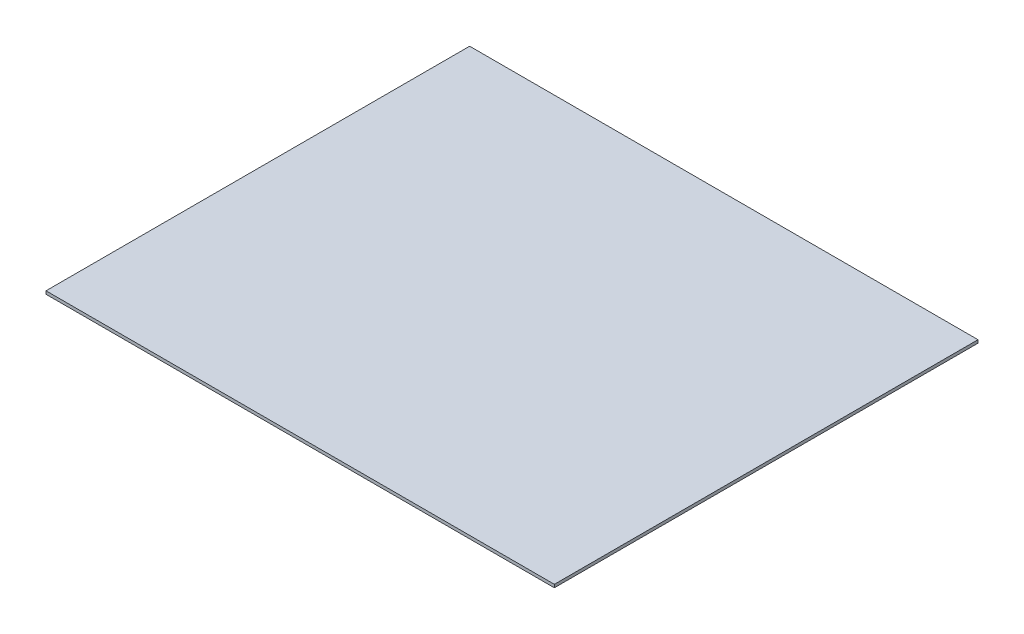
ISO-10303-21;
HEADER;
FILE_DESCRIPTION(('STEP AP214'),'2;1');
FILE_NAME('part.step','',(''),(''),'','','');
FILE_SCHEMA(('AUTOMOTIVE_DESIGN { 1 0 10303 214 1 1 1 1 }'));
ENDSEC;
DATA;
#1=APPLICATION_CONTEXT('core data for automotive mechanical design processes');
#2=APPLICATION_PROTOCOL_DEFINITION('international standard','automotive_design',2000,#1);
#3=PRODUCT_CONTEXT('',#1,'mechanical');
#4=PRODUCT('Part','Part','',(#3));
#5=PRODUCT_RELATED_PRODUCT_CATEGORY('part','',(#4));
#6=PRODUCT_DEFINITION_FORMATION('','',#4);
#7=PRODUCT_DEFINITION_CONTEXT('part definition',#1,'design');
#8=PRODUCT_DEFINITION('design','',#6,#7);
#9=PRODUCT_DEFINITION_SHAPE('','',#8);
#10=(LENGTH_UNIT() NAMED_UNIT(*) SI_UNIT(.MILLI.,.METRE.));
#11=(NAMED_UNIT(*) PLANE_ANGLE_UNIT() SI_UNIT($,.RADIAN.));
#12=(NAMED_UNIT(*) SI_UNIT($,.STERADIAN.) SOLID_ANGLE_UNIT());
#13=UNCERTAINTY_MEASURE_WITH_UNIT(LENGTH_MEASURE(1.E-05),#10,'distance_accuracy_value','');
#14=(GEOMETRIC_REPRESENTATION_CONTEXT(3) GLOBAL_UNCERTAINTY_ASSIGNED_CONTEXT((#13)) GLOBAL_UNIT_ASSIGNED_CONTEXT((#10,
#11,#12)) REPRESENTATION_CONTEXT('',''));
#15=CARTESIAN_POINT('',(0.,0.,0.));
#16=DIRECTION('',(0.,0.,1.));
#17=DIRECTION('',(1.,0.,0.));
#18=AXIS2_PLACEMENT_3D('',#15,#16,#17);
#19=CARTESIAN_POINT('',(0.,0.91186,0.));
#20=DIRECTION('',(1.,0.,0.));
#21=DIRECTION('',(0.,0.,-1.));
#22=AXIS2_PLACEMENT_3D('',#19,#20,#21);
#23=PLANE('',#22);
#24=DIRECTION('',(0.,0.,1.));
#25=VECTOR('',#24,1.);
#26=CARTESIAN_POINT('',(0.,0.,0.));
#27=LINE('',#26,#25);
#28=CARTESIAN_POINT('',(0.,0.,-127.));
#29=VERTEX_POINT('',#28);
#30=CARTESIAN_POINT('',(0.,0.,0.));
#31=VERTEX_POINT('',#30);
#32=EDGE_CURVE('E107',#29,#31,#27,.T.);
#33=ORIENTED_EDGE('',*,*,#32,.T.);
#34=DIRECTION('',(0.,-1.,0.));
#35=VECTOR('',#34,1.);
#36=CARTESIAN_POINT('',(0.,0.91186,0.));
#37=LINE('',#36,#35);
#38=CARTESIAN_POINT('',(0.,0.91186,0.));
#39=VERTEX_POINT('',#38);
#40=EDGE_CURVE('E11',#39,#31,#37,.T.);
#41=ORIENTED_EDGE('',*,*,#40,.F.);
#42=DIRECTION('',(0.,0.,1.));
#43=VECTOR('',#42,1.);
#44=CARTESIAN_POINT('',(0.,0.91186,0.));
#45=LINE('',#44,#43);
#46=CARTESIAN_POINT('',(0.,0.91186,-127.));
#47=VERTEX_POINT('',#46);
#48=EDGE_CURVE('E91',#47,#39,#45,.T.);
#49=ORIENTED_EDGE('',*,*,#48,.F.);
#50=DIRECTION('',(0.,-1.,0.));
#51=VECTOR('',#50,1.);
#52=CARTESIAN_POINT('',(0.,0.91186,-127.));
#53=LINE('',#52,#51);
#54=EDGE_CURVE('E103',#47,#29,#53,.T.);
#55=ORIENTED_EDGE('',*,*,#54,.T.);
#56=EDGE_LOOP('',(#33,#41,#49,#55));
#57=FACE_BOUND('',#56,.T.);
#58=ADVANCED_FACE('F39',(#57),#23,.F.);
#59=CARTESIAN_POINT('',(0.,0.91186,0.));
#60=DIRECTION('',(0.,0.,-1.));
#61=DIRECTION('',(-1.,0.,0.));
#62=AXIS2_PLACEMENT_3D('',#59,#60,#61);
#63=PLANE('',#62);
#64=DIRECTION('',(1.,0.,0.));
#65=VECTOR('',#64,1.);
#66=CARTESIAN_POINT('',(0.,0.,0.));
#67=LINE('',#66,#65);
#68=CARTESIAN_POINT('',(152.4,0.,0.));
#69=VERTEX_POINT('',#68);
#70=EDGE_CURVE('E96',#31,#69,#67,.T.);
#71=ORIENTED_EDGE('',*,*,#70,.T.);
#72=DIRECTION('',(0.,-1.,0.));
#73=VECTOR('',#72,1.);
#74=CARTESIAN_POINT('',(152.4,0.91186,0.));
#75=LINE('',#74,#73);
#76=CARTESIAN_POINT('',(152.4,0.91186,0.));
#77=VERTEX_POINT('',#76);
#78=EDGE_CURVE('E48',#77,#69,#75,.T.);
#79=ORIENTED_EDGE('',*,*,#78,.F.);
#80=DIRECTION('',(1.,0.,0.));
#81=VECTOR('',#80,1.);
#82=CARTESIAN_POINT('',(0.,0.91186,0.));
#83=LINE('',#82,#81);
#84=EDGE_CURVE('E86',#39,#77,#83,.T.);
#85=ORIENTED_EDGE('',*,*,#84,.F.);
#86=ORIENTED_EDGE('',*,*,#40,.T.);
#87=EDGE_LOOP('',(#71,#79,#85,#86));
#88=FACE_BOUND('',#87,.T.);
#89=ADVANCED_FACE('F95',(#88),#63,.F.);
#90=CARTESIAN_POINT('',(152.4,0.91186,0.));
#91=DIRECTION('',(-1.,0.,0.));
#92=DIRECTION('',(0.,0.,1.));
#93=AXIS2_PLACEMENT_3D('',#90,#91,#92);
#94=PLANE('',#93);
#95=DIRECTION('',(0.,0.,-1.));
#96=VECTOR('',#95,1.);
#97=CARTESIAN_POINT('',(152.4,0.,0.));
#98=LINE('',#97,#96);
#99=CARTESIAN_POINT('',(152.4,0.,-127.));
#100=VERTEX_POINT('',#99);
#101=EDGE_CURVE('E73',#69,#100,#98,.T.);
#102=ORIENTED_EDGE('',*,*,#101,.T.);
#103=DIRECTION('',(0.,-1.,0.));
#104=VECTOR('',#103,1.);
#105=CARTESIAN_POINT('',(152.4,0.91186,-127.));
#106=LINE('',#105,#104);
#107=CARTESIAN_POINT('',(152.4,0.91186,-127.));
#108=VERTEX_POINT('',#107);
#109=EDGE_CURVE('E98',#108,#100,#106,.T.);
#110=ORIENTED_EDGE('',*,*,#109,.F.);
#111=DIRECTION('',(0.,0.,-1.));
#112=VECTOR('',#111,1.);
#113=CARTESIAN_POINT('',(152.4,0.91186,0.));
#114=LINE('',#113,#112);
#115=EDGE_CURVE('E89',#77,#108,#114,.T.);
#116=ORIENTED_EDGE('',*,*,#115,.F.);
#117=ORIENTED_EDGE('',*,*,#78,.T.);
#118=EDGE_LOOP('',(#102,#110,#116,#117));
#119=FACE_BOUND('',#118,.T.);
#120=ADVANCED_FACE('F99',(#119),#94,.F.);
#121=CARTESIAN_POINT('',(0.,0.91186,-127.));
#122=DIRECTION('',(0.,0.,1.));
#123=DIRECTION('',(1.,0.,0.));
#124=AXIS2_PLACEMENT_3D('',#121,#122,#123);
#125=PLANE('',#124);
#126=DIRECTION('',(-1.,0.,0.));
#127=VECTOR('',#126,1.);
#128=CARTESIAN_POINT('',(0.,0.,-127.));
#129=LINE('',#128,#127);
#130=EDGE_CURVE('E79',#100,#29,#129,.T.);
#131=ORIENTED_EDGE('',*,*,#130,.T.);
#132=ORIENTED_EDGE('',*,*,#54,.F.);
#133=DIRECTION('',(-1.,0.,0.));
#134=VECTOR('',#133,1.);
#135=CARTESIAN_POINT('',(0.,0.91186,-127.));
#136=LINE('',#135,#134);
#137=EDGE_CURVE('E56',#108,#47,#136,.T.);
#138=ORIENTED_EDGE('',*,*,#137,.F.);
#139=ORIENTED_EDGE('',*,*,#109,.T.);
#140=EDGE_LOOP('',(#131,#132,#138,#139));
#141=FACE_BOUND('',#140,.T.);
#142=ADVANCED_FACE('F120',(#141),#125,.F.);
#143=CARTESIAN_POINT('',(0.,0.91186,0.));
#144=DIRECTION('',(0.,-1.,0.));
#145=DIRECTION('',(0.,0.,-1.));
#146=AXIS2_PLACEMENT_3D('',#143,#144,#145);
#147=PLANE('',#146);
#148=ORIENTED_EDGE('',*,*,#48,.T.);
#149=ORIENTED_EDGE('',*,*,#84,.T.);
#150=ORIENTED_EDGE('',*,*,#115,.T.);
#151=ORIENTED_EDGE('',*,*,#137,.T.);
#152=EDGE_LOOP('',(#148,#149,#150,#151));
#153=FACE_BOUND('',#152,.T.);
#154=ADVANCED_FACE('F87',(#153),#147,.F.);
#155=CARTESIAN_POINT('',(0.,0.,0.));
#156=DIRECTION('',(0.,-1.,0.));
#157=DIRECTION('',(0.,0.,-1.));
#158=AXIS2_PLACEMENT_3D('',#155,#156,#157);
#159=PLANE('',#158);
#160=ORIENTED_EDGE('',*,*,#32,.F.);
#161=ORIENTED_EDGE('',*,*,#130,.F.);
#162=ORIENTED_EDGE('',*,*,#101,.F.);
#163=ORIENTED_EDGE('',*,*,#70,.F.);
#164=EDGE_LOOP('',(#160,#161,#162,#163));
#165=FACE_BOUND('',#164,.T.);
#166=ADVANCED_FACE('F123',(#165),#159,.T.);
#167=CLOSED_SHELL('',(#58,#89,#120,#142,#154,#166));
#168=MANIFOLD_SOLID_BREP('B2',#167);
#169=ADVANCED_BREP_SHAPE_REPRESENTATION('',(#18,#168),#14);
#170=SHAPE_DEFINITION_REPRESENTATION(#9,#169);
ENDSEC;
END-ISO-10303-21;
